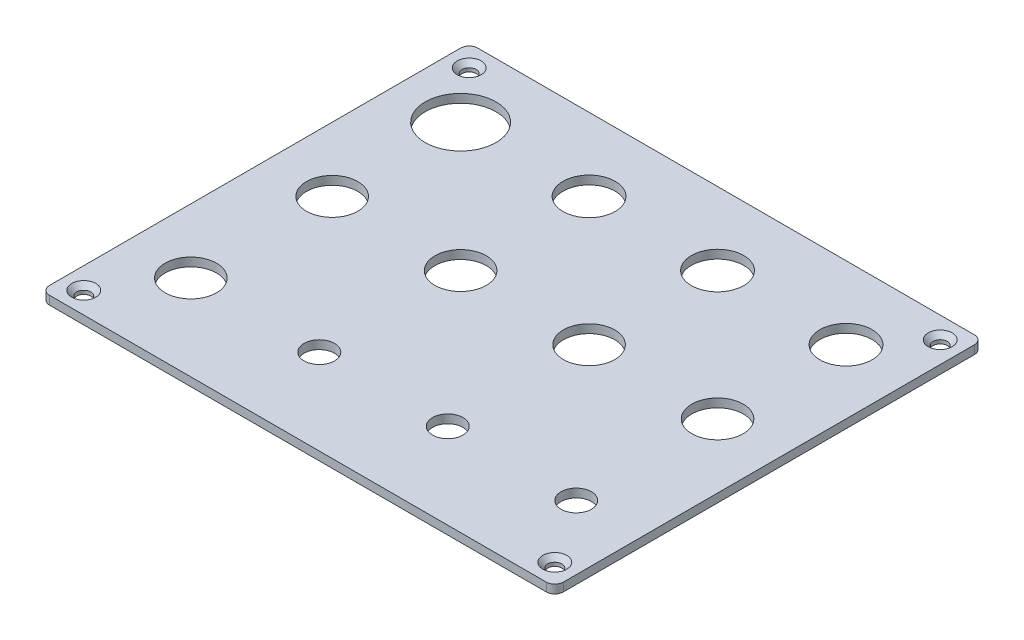
ISO-10303-21;
HEADER;
FILE_DESCRIPTION(('STEP AP214'),'2;1');
FILE_NAME('part.step','',(''),(''),'','','');
FILE_SCHEMA(('AUTOMOTIVE_DESIGN { 1 0 10303 214 1 1 1 1 }'));
ENDSEC;
DATA;
#1=APPLICATION_CONTEXT('core data for automotive mechanical design processes');
#2=APPLICATION_PROTOCOL_DEFINITION('international standard','automotive_design',2000,#1);
#3=PRODUCT_CONTEXT('',#1,'mechanical');
#4=PRODUCT('Part','Part','',(#3));
#5=PRODUCT_RELATED_PRODUCT_CATEGORY('part','',(#4));
#6=PRODUCT_DEFINITION_FORMATION('','',#4);
#7=PRODUCT_DEFINITION_CONTEXT('part definition',#1,'design');
#8=PRODUCT_DEFINITION('design','',#6,#7);
#9=PRODUCT_DEFINITION_SHAPE('','',#8);
#10=(LENGTH_UNIT() NAMED_UNIT(*) SI_UNIT(.MILLI.,.METRE.));
#11=(NAMED_UNIT(*) PLANE_ANGLE_UNIT() SI_UNIT($,.RADIAN.));
#12=(NAMED_UNIT(*) SI_UNIT($,.STERADIAN.) SOLID_ANGLE_UNIT());
#13=UNCERTAINTY_MEASURE_WITH_UNIT(LENGTH_MEASURE(1.E-05),#10,'distance_accuracy_value','');
#14=(GEOMETRIC_REPRESENTATION_CONTEXT(3) GLOBAL_UNCERTAINTY_ASSIGNED_CONTEXT((#13)) GLOBAL_UNIT_ASSIGNED_CONTEXT((#10,
#11,#12)) REPRESENTATION_CONTEXT('',''));
#15=CARTESIAN_POINT('',(0.,0.,0.));
#16=DIRECTION('',(0.,0.,1.));
#17=DIRECTION('',(1.,0.,0.));
#18=AXIS2_PLACEMENT_3D('',#15,#16,#17);
#19=CARTESIAN_POINT('',(-118.,2.,-1.99999999999999));
#20=DIRECTION('',(0.,-1.,0.));
#21=DIRECTION('',(0.,0.,-1.));
#22=AXIS2_PLACEMENT_3D('',#19,#20,#21);
#23=CYLINDRICAL_SURFACE('',#22,2.);
#24=DIRECTION('',(0.,-1.,0.));
#25=VECTOR('',#24,1.);
#26=CARTESIAN_POINT('',(-118.,2.,0.));
#27=LINE('',#26,#25);
#28=CARTESIAN_POINT('',(-118.,2.,0.));
#29=VERTEX_POINT('',#28);
#30=CARTESIAN_POINT('',(-118.,0.,0.));
#31=VERTEX_POINT('',#30);
#32=EDGE_CURVE('E165',#29,#31,#27,.T.);
#33=ORIENTED_EDGE('',*,*,#32,.F.);
#34=CARTESIAN_POINT('',(-118.,2.,-1.99999999999999));
#35=DIRECTION('',(0.,1.,0.));
#36=DIRECTION('',(0.,0.,1.));
#37=AXIS2_PLACEMENT_3D('',#34,#35,#36);
#38=CIRCLE('',#37,2.);
#39=CARTESIAN_POINT('',(-120.,2.,-1.99999999999999));
#40=VERTEX_POINT('',#39);
#41=EDGE_CURVE('E39',#40,#29,#38,.T.);
#42=ORIENTED_EDGE('',*,*,#41,.F.);
#43=DIRECTION('',(0.,-1.,0.));
#44=VECTOR('',#43,1.);
#45=CARTESIAN_POINT('',(-120.,2.,-1.99999999999999));
#46=LINE('',#45,#44);
#47=CARTESIAN_POINT('',(-120.,0.,-1.99999999999999));
#48=VERTEX_POINT('',#47);
#49=EDGE_CURVE('E168',#48,#40,#46,.F.);
#50=ORIENTED_EDGE('',*,*,#49,.F.);
#51=CARTESIAN_POINT('',(-118.,0.,-1.99999999999999));
#52=DIRECTION('',(0.,1.,0.));
#53=DIRECTION('',(0.,0.,1.));
#54=AXIS2_PLACEMENT_3D('',#51,#52,#53);
#55=CIRCLE('',#54,2.);
#56=EDGE_CURVE('E11',#31,#48,#55,.F.);
#57=ORIENTED_EDGE('',*,*,#56,.F.);
#58=EDGE_LOOP('',(#33,#42,#50,#57));
#59=FACE_BOUND('',#58,.T.);
#60=ADVANCED_FACE('F32',(#59),#23,.T.);
#61=CARTESIAN_POINT('',(-2.,2.,-2.));
#62=DIRECTION('',(0.,-1.,0.));
#63=DIRECTION('',(0.,0.,-1.));
#64=AXIS2_PLACEMENT_3D('',#61,#62,#63);
#65=CYLINDRICAL_SURFACE('',#64,2.);
#66=DIRECTION('',(0.,-1.,0.));
#67=VECTOR('',#66,1.);
#68=CARTESIAN_POINT('',(0.,2.,-2.));
#69=LINE('',#68,#67);
#70=CARTESIAN_POINT('',(0.,2.,-2.));
#71=VERTEX_POINT('',#70);
#72=CARTESIAN_POINT('',(0.,0.,-2.));
#73=VERTEX_POINT('',#72);
#74=EDGE_CURVE('E154',#71,#73,#69,.T.);
#75=ORIENTED_EDGE('',*,*,#74,.F.);
#76=CARTESIAN_POINT('',(-2.,2.,-2.));
#77=DIRECTION('',(0.,1.,0.));
#78=DIRECTION('',(0.,0.,1.));
#79=AXIS2_PLACEMENT_3D('',#76,#77,#78);
#80=CIRCLE('',#79,2.);
#81=CARTESIAN_POINT('',(-2.,2.,0.));
#82=VERTEX_POINT('',#81);
#83=EDGE_CURVE('E160',#82,#71,#80,.T.);
#84=ORIENTED_EDGE('',*,*,#83,.F.);
#85=DIRECTION('',(0.,-1.,0.));
#86=VECTOR('',#85,1.);
#87=CARTESIAN_POINT('',(-2.,2.,0.));
#88=LINE('',#87,#86);
#89=CARTESIAN_POINT('',(-2.,0.,0.));
#90=VERTEX_POINT('',#89);
#91=EDGE_CURVE('E157',#90,#82,#88,.F.);
#92=ORIENTED_EDGE('',*,*,#91,.F.);
#93=CARTESIAN_POINT('',(-2.,0.,-2.));
#94=DIRECTION('',(0.,1.,0.));
#95=DIRECTION('',(0.,0.,1.));
#96=AXIS2_PLACEMENT_3D('',#93,#94,#95);
#97=CIRCLE('',#96,2.);
#98=EDGE_CURVE('E162',#73,#90,#97,.F.);
#99=ORIENTED_EDGE('',*,*,#98,.F.);
#100=EDGE_LOOP('',(#75,#84,#92,#99));
#101=FACE_BOUND('',#100,.T.);
#102=ADVANCED_FACE('F207',(#101),#65,.T.);
#103=CARTESIAN_POINT('',(-2.,2.,-98.));
#104=DIRECTION('',(0.,-1.,0.));
#105=DIRECTION('',(0.,0.,-1.));
#106=AXIS2_PLACEMENT_3D('',#103,#104,#105);
#107=CYLINDRICAL_SURFACE('',#106,2.);
#108=DIRECTION('',(0.,-1.,0.));
#109=VECTOR('',#108,1.);
#110=CARTESIAN_POINT('',(-2.,2.,-100.));
#111=LINE('',#110,#109);
#112=CARTESIAN_POINT('',(-2.,2.,-100.));
#113=VERTEX_POINT('',#112);
#114=CARTESIAN_POINT('',(-2.,0.,-100.));
#115=VERTEX_POINT('',#114);
#116=EDGE_CURVE('E104',#113,#115,#111,.T.);
#117=ORIENTED_EDGE('',*,*,#116,.F.);
#118=CARTESIAN_POINT('',(-2.,2.,-98.));
#119=DIRECTION('',(0.,1.,0.));
#120=DIRECTION('',(0.,0.,1.));
#121=AXIS2_PLACEMENT_3D('',#118,#119,#120);
#122=CIRCLE('',#121,2.);
#123=CARTESIAN_POINT('',(0.,2.,-98.));
#124=VERTEX_POINT('',#123);
#125=EDGE_CURVE('E149',#124,#113,#122,.T.);
#126=ORIENTED_EDGE('',*,*,#125,.F.);
#127=DIRECTION('',(0.,-1.,0.));
#128=VECTOR('',#127,1.);
#129=CARTESIAN_POINT('',(0.,2.,-98.));
#130=LINE('',#129,#128);
#131=CARTESIAN_POINT('',(0.,0.,-98.));
#132=VERTEX_POINT('',#131);
#133=EDGE_CURVE('E146',#132,#124,#130,.F.);
#134=ORIENTED_EDGE('',*,*,#133,.F.);
#135=CARTESIAN_POINT('',(-2.,0.,-98.));
#136=DIRECTION('',(0.,1.,0.));
#137=DIRECTION('',(0.,0.,1.));
#138=AXIS2_PLACEMENT_3D('',#135,#136,#137);
#139=CIRCLE('',#138,2.);
#140=EDGE_CURVE('E151',#115,#132,#139,.F.);
#141=ORIENTED_EDGE('',*,*,#140,.F.);
#142=EDGE_LOOP('',(#117,#126,#134,#141));
#143=FACE_BOUND('',#142,.T.);
#144=ADVANCED_FACE('F202',(#143),#107,.T.);
#145=CARTESIAN_POINT('',(-118.,2.,-98.));
#146=DIRECTION('',(0.,-1.,0.));
#147=DIRECTION('',(0.,0.,-1.));
#148=AXIS2_PLACEMENT_3D('',#145,#146,#147);
#149=CYLINDRICAL_SURFACE('',#148,2.);
#150=DIRECTION('',(0.,-1.,0.));
#151=VECTOR('',#150,1.);
#152=CARTESIAN_POINT('',(-120.,2.,-98.));
#153=LINE('',#152,#151);
#154=CARTESIAN_POINT('',(-120.,2.,-98.));
#155=VERTEX_POINT('',#154);
#156=CARTESIAN_POINT('',(-120.,0.,-98.));
#157=VERTEX_POINT('',#156);
#158=EDGE_CURVE('E99',#155,#157,#153,.T.);
#159=ORIENTED_EDGE('',*,*,#158,.F.);
#160=CARTESIAN_POINT('',(-118.,2.,-98.));
#161=DIRECTION('',(0.,1.,0.));
#162=DIRECTION('',(0.,0.,1.));
#163=AXIS2_PLACEMENT_3D('',#160,#161,#162);
#164=CIRCLE('',#163,2.);
#165=CARTESIAN_POINT('',(-118.,2.,-100.));
#166=VERTEX_POINT('',#165);
#167=EDGE_CURVE('E105',#166,#155,#164,.T.);
#168=ORIENTED_EDGE('',*,*,#167,.F.);
#169=DIRECTION('',(0.,-1.,0.));
#170=VECTOR('',#169,1.);
#171=CARTESIAN_POINT('',(-118.,2.,-100.));
#172=LINE('',#171,#170);
#173=CARTESIAN_POINT('',(-118.,0.,-100.));
#174=VERTEX_POINT('',#173);
#175=EDGE_CURVE('E102',#174,#166,#172,.F.);
#176=ORIENTED_EDGE('',*,*,#175,.F.);
#177=CARTESIAN_POINT('',(-118.,0.,-98.));
#178=DIRECTION('',(0.,1.,0.));
#179=DIRECTION('',(0.,0.,1.));
#180=AXIS2_PLACEMENT_3D('',#177,#178,#179);
#181=CIRCLE('',#180,2.);
#182=EDGE_CURVE('E95',#157,#174,#181,.F.);
#183=ORIENTED_EDGE('',*,*,#182,.F.);
#184=EDGE_LOOP('',(#159,#168,#176,#183));
#185=FACE_BOUND('',#184,.T.);
#186=ADVANCED_FACE('F97',(#185),#149,.T.);
#187=CARTESIAN_POINT('',(0.,2.,0.));
#188=DIRECTION('',(-1.,0.,0.));
#189=DIRECTION('',(0.,0.,1.));
#190=AXIS2_PLACEMENT_3D('',#187,#188,#189);
#191=PLANE('',#190);
#192=DIRECTION('',(0.,0.,-1.));
#193=VECTOR('',#192,1.);
#194=CARTESIAN_POINT('',(0.,2.,0.));
#195=LINE('',#194,#193);
#196=EDGE_CURVE('E119',#71,#124,#195,.T.);
#197=ORIENTED_EDGE('',*,*,#196,.F.);
#198=ORIENTED_EDGE('',*,*,#74,.T.);
#199=DIRECTION('',(0.,0.,-1.));
#200=VECTOR('',#199,1.);
#201=CARTESIAN_POINT('',(0.,0.,0.));
#202=LINE('',#201,#200);
#203=EDGE_CURVE('E121',#73,#132,#202,.T.);
#204=ORIENTED_EDGE('',*,*,#203,.T.);
#205=ORIENTED_EDGE('',*,*,#133,.T.);
#206=EDGE_LOOP('',(#197,#198,#204,#205));
#207=FACE_BOUND('',#206,.T.);
#208=ADVANCED_FACE('F204',(#207),#191,.F.);
#209=CARTESIAN_POINT('',(0.,2.,-100.));
#210=DIRECTION('',(0.,0.,1.));
#211=DIRECTION('',(1.,0.,0.));
#212=AXIS2_PLACEMENT_3D('',#209,#210,#211);
#213=PLANE('',#212);
#214=DIRECTION('',(-1.,0.,0.));
#215=VECTOR('',#214,1.);
#216=CARTESIAN_POINT('',(0.,2.,-100.));
#217=LINE('',#216,#215);
#218=EDGE_CURVE('E177',#113,#166,#217,.T.);
#219=ORIENTED_EDGE('',*,*,#218,.F.);
#220=ORIENTED_EDGE('',*,*,#116,.T.);
#221=DIRECTION('',(-1.,0.,0.));
#222=VECTOR('',#221,1.);
#223=CARTESIAN_POINT('',(0.,0.,-100.));
#224=LINE('',#223,#222);
#225=EDGE_CURVE('E117',#115,#174,#224,.T.);
#226=ORIENTED_EDGE('',*,*,#225,.T.);
#227=ORIENTED_EDGE('',*,*,#175,.T.);
#228=EDGE_LOOP('',(#219,#220,#226,#227));
#229=FACE_BOUND('',#228,.T.);
#230=ADVANCED_FACE('F199',(#229),#213,.F.);
#231=CARTESIAN_POINT('',(-120.,2.,0.));
#232=DIRECTION('',(1.,0.,0.));
#233=DIRECTION('',(0.,0.,-1.));
#234=AXIS2_PLACEMENT_3D('',#231,#232,#233);
#235=PLANE('',#234);
#236=DIRECTION('',(0.,0.,1.));
#237=VECTOR('',#236,1.);
#238=CARTESIAN_POINT('',(-120.,0.,0.));
#239=LINE('',#238,#237);
#240=EDGE_CURVE('E110',#157,#48,#239,.T.);
#241=ORIENTED_EDGE('',*,*,#240,.T.);
#242=ORIENTED_EDGE('',*,*,#49,.T.);
#243=DIRECTION('',(0.,0.,1.));
#244=VECTOR('',#243,1.);
#245=CARTESIAN_POINT('',(-120.,2.,0.));
#246=LINE('',#245,#244);
#247=EDGE_CURVE('E112',#155,#40,#246,.T.);
#248=ORIENTED_EDGE('',*,*,#247,.F.);
#249=ORIENTED_EDGE('',*,*,#158,.T.);
#250=EDGE_LOOP('',(#241,#242,#248,#249));
#251=FACE_BOUND('',#250,.T.);
#252=ADVANCED_FACE('F109',(#251),#235,.F.);
#253=CARTESIAN_POINT('',(0.,2.,0.));
#254=DIRECTION('',(0.,0.,-1.));
#255=DIRECTION('',(-1.,0.,0.));
#256=AXIS2_PLACEMENT_3D('',#253,#254,#255);
#257=PLANE('',#256);
#258=DIRECTION('',(1.,0.,0.));
#259=VECTOR('',#258,1.);
#260=CARTESIAN_POINT('',(0.,2.,0.));
#261=LINE('',#260,#259);
#262=EDGE_CURVE('E113',#29,#82,#261,.T.);
#263=ORIENTED_EDGE('',*,*,#262,.F.);
#264=ORIENTED_EDGE('',*,*,#32,.T.);
#265=DIRECTION('',(1.,0.,0.));
#266=VECTOR('',#265,1.);
#267=CARTESIAN_POINT('',(0.,0.,0.));
#268=LINE('',#267,#266);
#269=EDGE_CURVE('E116',#31,#90,#268,.T.);
#270=ORIENTED_EDGE('',*,*,#269,.T.);
#271=ORIENTED_EDGE('',*,*,#91,.T.);
#272=EDGE_LOOP('',(#263,#264,#270,#271));
#273=FACE_BOUND('',#272,.T.);
#274=ADVANCED_FACE('F174',(#273),#257,.F.);
#275=CARTESIAN_POINT('',(0.,2.,0.));
#276=DIRECTION('',(0.,1.,0.));
#277=DIRECTION('',(0.,0.,1.));
#278=AXIS2_PLACEMENT_3D('',#275,#276,#277);
#279=PLANE('',#278);
#280=CARTESIAN_POINT('',(-115.,2.,-4.99999999999999));
#281=DIRECTION('',(0.,1.,0.));
#282=DIRECTION('',(0.,0.,1.));
#283=AXIS2_PLACEMENT_3D('',#280,#281,#282);
#284=CIRCLE('',#283,2.79999999999999);
#285=CARTESIAN_POINT('',(-115.,2.,-2.2));
#286=VERTEX_POINT('',#285);
#287=EDGE_CURVE('E140',#286,#286,#284,.T.);
#288=ORIENTED_EDGE('',*,*,#287,.F.);
#289=EDGE_LOOP('',(#288));
#290=FACE_BOUND('',#289,.T.);
#291=CARTESIAN_POINT('',(-5.,2.,-4.99999999999999));
#292=DIRECTION('',(0.,1.,0.));
#293=DIRECTION('',(0.,0.,1.));
#294=AXIS2_PLACEMENT_3D('',#291,#292,#293);
#295=CIRCLE('',#294,2.8);
#296=CARTESIAN_POINT('',(-5.,2.,-2.19999999999999));
#297=VERTEX_POINT('',#296);
#298=EDGE_CURVE('E137',#297,#297,#295,.T.);
#299=ORIENTED_EDGE('',*,*,#298,.F.);
#300=EDGE_LOOP('',(#299));
#301=FACE_BOUND('',#300,.T.);
#302=CARTESIAN_POINT('',(-5.,2.,-95.));
#303=DIRECTION('',(0.,1.,0.));
#304=DIRECTION('',(0.,0.,1.));
#305=AXIS2_PLACEMENT_3D('',#302,#303,#304);
#306=CIRCLE('',#305,2.8);
#307=CARTESIAN_POINT('',(-5.,2.,-92.2));
#308=VERTEX_POINT('',#307);
#309=EDGE_CURVE('E133',#308,#308,#306,.T.);
#310=ORIENTED_EDGE('',*,*,#309,.F.);
#311=EDGE_LOOP('',(#310));
#312=FACE_BOUND('',#311,.T.);
#313=CARTESIAN_POINT('',(-115.,2.,-95.));
#314=DIRECTION('',(0.,1.,0.));
#315=DIRECTION('',(0.,0.,1.));
#316=AXIS2_PLACEMENT_3D('',#313,#314,#315);
#317=CIRCLE('',#316,2.79999999999999);
#318=CARTESIAN_POINT('',(-115.,2.,-92.2));
#319=VERTEX_POINT('',#318);
#320=EDGE_CURVE('E129',#319,#319,#317,.T.);
#321=ORIENTED_EDGE('',*,*,#320,.F.);
#322=EDGE_LOOP('',(#321));
#323=FACE_BOUND('',#322,.T.);
#324=CARTESIAN_POINT('',(-105.,2.,-20.));
#325=DIRECTION('',(0.,1.,0.));
#326=DIRECTION('',(0.,0.,1.));
#327=AXIS2_PLACEMENT_3D('',#324,#325,#326);
#328=CIRCLE('',#327,6.);
#329=CARTESIAN_POINT('',(-105.,2.,-14.));
#330=VERTEX_POINT('',#329);
#331=EDGE_CURVE('E332',#330,#330,#328,.T.);
#332=ORIENTED_EDGE('',*,*,#331,.F.);
#333=EDGE_LOOP('',(#332));
#334=FACE_BOUND('',#333,.T.);
#335=CARTESIAN_POINT('',(-15.,2.,-20.));
#336=DIRECTION('',(0.,1.,0.));
#337=DIRECTION('',(0.,0.,1.));
#338=AXIS2_PLACEMENT_3D('',#335,#336,#337);
#339=CIRCLE('',#338,3.55);
#340=CARTESIAN_POINT('',(-15.,2.,-16.45));
#341=VERTEX_POINT('',#340);
#342=EDGE_CURVE('E336',#341,#341,#339,.T.);
#343=ORIENTED_EDGE('',*,*,#342,.F.);
#344=EDGE_LOOP('',(#343));
#345=FACE_BOUND('',#344,.T.);
#346=CARTESIAN_POINT('',(-45.,2.,-20.));
#347=DIRECTION('',(0.,1.,0.));
#348=DIRECTION('',(0.,0.,1.));
#349=AXIS2_PLACEMENT_3D('',#346,#347,#348);
#350=CIRCLE('',#349,3.55);
#351=CARTESIAN_POINT('',(-45.,2.,-16.45));
#352=VERTEX_POINT('',#351);
#353=EDGE_CURVE('E342',#352,#352,#350,.T.);
#354=ORIENTED_EDGE('',*,*,#353,.F.);
#355=EDGE_LOOP('',(#354));
#356=FACE_BOUND('',#355,.T.);
#357=CARTESIAN_POINT('',(-75.,2.,-20.));
#358=DIRECTION('',(0.,1.,0.));
#359=DIRECTION('',(0.,0.,1.));
#360=AXIS2_PLACEMENT_3D('',#357,#358,#359);
#361=CIRCLE('',#360,3.55);
#362=CARTESIAN_POINT('',(-75.,2.,-16.45));
#363=VERTEX_POINT('',#362);
#364=EDGE_CURVE('E348',#363,#363,#361,.T.);
#365=ORIENTED_EDGE('',*,*,#364,.F.);
#366=EDGE_LOOP('',(#365));
#367=FACE_BOUND('',#366,.T.);
#368=CARTESIAN_POINT('',(-15.,2.,-83.));
#369=DIRECTION('',(0.,1.,0.));
#370=DIRECTION('',(0.,0.,1.));
#371=AXIS2_PLACEMENT_3D('',#368,#369,#370);
#372=CIRCLE('',#371,6.09999999999999);
#373=CARTESIAN_POINT('',(-15.,2.,-76.9));
#374=VERTEX_POINT('',#373);
#375=EDGE_CURVE('E354',#374,#374,#372,.T.);
#376=ORIENTED_EDGE('',*,*,#375,.F.);
#377=EDGE_LOOP('',(#376));
#378=FACE_BOUND('',#377,.T.);
#379=CARTESIAN_POINT('',(-45.,2.,-83.));
#380=DIRECTION('',(0.,1.,0.));
#381=DIRECTION('',(0.,0.,1.));
#382=AXIS2_PLACEMENT_3D('',#379,#380,#381);
#383=CIRCLE('',#382,6.1);
#384=CARTESIAN_POINT('',(-45.,2.,-76.9));
#385=VERTEX_POINT('',#384);
#386=EDGE_CURVE('E360',#385,#385,#383,.T.);
#387=ORIENTED_EDGE('',*,*,#386,.F.);
#388=EDGE_LOOP('',(#387));
#389=FACE_BOUND('',#388,.T.);
#390=CARTESIAN_POINT('',(-75.,2.,-83.));
#391=DIRECTION('',(0.,1.,0.));
#392=DIRECTION('',(0.,0.,1.));
#393=AXIS2_PLACEMENT_3D('',#390,#391,#392);
#394=CIRCLE('',#393,6.09999999999999);
#395=CARTESIAN_POINT('',(-75.,2.,-76.9));
#396=VERTEX_POINT('',#395);
#397=EDGE_CURVE('E366',#396,#396,#394,.T.);
#398=ORIENTED_EDGE('',*,*,#397,.F.);
#399=EDGE_LOOP('',(#398));
#400=FACE_BOUND('',#399,.T.);
#401=CARTESIAN_POINT('',(-105.,2.,-83.));
#402=DIRECTION('',(0.,1.,0.));
#403=DIRECTION('',(0.,0.,1.));
#404=AXIS2_PLACEMENT_3D('',#401,#402,#403);
#405=CIRCLE('',#404,8.25000000000001);
#406=CARTESIAN_POINT('',(-105.,2.,-74.75));
#407=VERTEX_POINT('',#406);
#408=EDGE_CURVE('E372',#407,#407,#405,.T.);
#409=ORIENTED_EDGE('',*,*,#408,.F.);
#410=EDGE_LOOP('',(#409));
#411=FACE_BOUND('',#410,.T.);
#412=CARTESIAN_POINT('',(-15.,2.,-53.));
#413=DIRECTION('',(0.,1.,0.));
#414=DIRECTION('',(0.,0.,1.));
#415=AXIS2_PLACEMENT_3D('',#412,#413,#414);
#416=CIRCLE('',#415,6.00000000000001);
#417=CARTESIAN_POINT('',(-15.,2.,-47.));
#418=VERTEX_POINT('',#417);
#419=EDGE_CURVE('E378',#418,#418,#416,.T.);
#420=ORIENTED_EDGE('',*,*,#419,.F.);
#421=EDGE_LOOP('',(#420));
#422=FACE_BOUND('',#421,.T.);
#423=CARTESIAN_POINT('',(-45.,2.,-53.));
#424=DIRECTION('',(0.,1.,0.));
#425=DIRECTION('',(0.,0.,1.));
#426=AXIS2_PLACEMENT_3D('',#423,#424,#425);
#427=CIRCLE('',#426,6.);
#428=CARTESIAN_POINT('',(-45.,2.,-47.));
#429=VERTEX_POINT('',#428);
#430=EDGE_CURVE('E384',#429,#429,#427,.T.);
#431=ORIENTED_EDGE('',*,*,#430,.F.);
#432=EDGE_LOOP('',(#431));
#433=FACE_BOUND('',#432,.T.);
#434=CARTESIAN_POINT('',(-75.,2.,-53.));
#435=DIRECTION('',(0.,1.,0.));
#436=DIRECTION('',(0.,0.,1.));
#437=AXIS2_PLACEMENT_3D('',#434,#435,#436);
#438=CIRCLE('',#437,6.);
#439=CARTESIAN_POINT('',(-75.,2.,-47.));
#440=VERTEX_POINT('',#439);
#441=EDGE_CURVE('E192',#440,#440,#438,.T.);
#442=ORIENTED_EDGE('',*,*,#441,.F.);
#443=EDGE_LOOP('',(#442));
#444=FACE_BOUND('',#443,.T.);
#445=CARTESIAN_POINT('',(-105.,2.,-53.));
#446=DIRECTION('',(0.,1.,0.));
#447=DIRECTION('',(0.,0.,1.));
#448=AXIS2_PLACEMENT_3D('',#445,#446,#447);
#449=CIRCLE('',#448,6.);
#450=CARTESIAN_POINT('',(-105.,2.,-47.));
#451=VERTEX_POINT('',#450);
#452=EDGE_CURVE('E184',#451,#451,#449,.T.);
#453=ORIENTED_EDGE('',*,*,#452,.F.);
#454=EDGE_LOOP('',(#453));
#455=FACE_BOUND('',#454,.T.);
#456=ORIENTED_EDGE('',*,*,#247,.T.);
#457=ORIENTED_EDGE('',*,*,#41,.T.);
#458=ORIENTED_EDGE('',*,*,#262,.T.);
#459=ORIENTED_EDGE('',*,*,#83,.T.);
#460=ORIENTED_EDGE('',*,*,#196,.T.);
#461=ORIENTED_EDGE('',*,*,#125,.T.);
#462=ORIENTED_EDGE('',*,*,#218,.T.);
#463=ORIENTED_EDGE('',*,*,#167,.T.);
#464=EDGE_LOOP('',(#456,#457,#458,#459,#460,#461,#462,#463));
#465=FACE_BOUND('',#464,.T.);
#466=ADVANCED_FACE('F170',(#290,#301,#312,#323,#334,#345,#356,#367,#378,#389,#400,#411,#422,
#433,#444,#455,#465),#279,.T.);
#467=CARTESIAN_POINT('',(0.,0.,0.));
#468=DIRECTION('',(0.,1.,0.));
#469=DIRECTION('',(0.,0.,1.));
#470=AXIS2_PLACEMENT_3D('',#467,#468,#469);
#471=PLANE('',#470);
#472=CARTESIAN_POINT('',(-115.,0.,-4.99999999999999));
#473=DIRECTION('',(0.,1.,0.));
#474=DIRECTION('',(0.,0.,1.));
#475=AXIS2_PLACEMENT_3D('',#472,#473,#474);
#476=CIRCLE('',#475,1.65);
#477=CARTESIAN_POINT('',(-115.,0.,-3.34999999999999));
#478=VERTEX_POINT('',#477);
#479=EDGE_CURVE('E128',#478,#478,#476,.T.);
#480=ORIENTED_EDGE('',*,*,#479,.T.);
#481=EDGE_LOOP('',(#480));
#482=FACE_BOUND('',#481,.T.);
#483=CARTESIAN_POINT('',(-5.,0.,-4.99999999999999));
#484=DIRECTION('',(0.,1.,0.));
#485=DIRECTION('',(0.,0.,1.));
#486=AXIS2_PLACEMENT_3D('',#483,#484,#485);
#487=CIRCLE('',#486,1.65);
#488=CARTESIAN_POINT('',(-5.,0.,-3.34999999999999));
#489=VERTEX_POINT('',#488);
#490=EDGE_CURVE('E319',#489,#489,#487,.T.);
#491=ORIENTED_EDGE('',*,*,#490,.T.);
#492=EDGE_LOOP('',(#491));
#493=FACE_BOUND('',#492,.T.);
#494=CARTESIAN_POINT('',(-5.,0.,-95.));
#495=DIRECTION('',(0.,1.,0.));
#496=DIRECTION('',(0.,0.,1.));
#497=AXIS2_PLACEMENT_3D('',#494,#495,#496);
#498=CIRCLE('',#497,1.65);
#499=CARTESIAN_POINT('',(-5.,0.,-93.35));
#500=VERTEX_POINT('',#499);
#501=EDGE_CURVE('E322',#500,#500,#498,.T.);
#502=ORIENTED_EDGE('',*,*,#501,.T.);
#503=EDGE_LOOP('',(#502));
#504=FACE_BOUND('',#503,.T.);
#505=CARTESIAN_POINT('',(-115.,0.,-95.));
#506=DIRECTION('',(0.,1.,0.));
#507=DIRECTION('',(0.,0.,1.));
#508=AXIS2_PLACEMENT_3D('',#505,#506,#507);
#509=CIRCLE('',#508,1.65);
#510=CARTESIAN_POINT('',(-115.,0.,-93.35));
#511=VERTEX_POINT('',#510);
#512=EDGE_CURVE('E329',#511,#511,#509,.T.);
#513=ORIENTED_EDGE('',*,*,#512,.T.);
#514=EDGE_LOOP('',(#513));
#515=FACE_BOUND('',#514,.T.);
#516=CARTESIAN_POINT('',(-105.,0.,-20.));
#517=DIRECTION('',(0.,1.,0.));
#518=DIRECTION('',(0.,0.,1.));
#519=AXIS2_PLACEMENT_3D('',#516,#517,#518);
#520=CIRCLE('',#519,6.);
#521=CARTESIAN_POINT('',(-105.,0.,-14.));
#522=VERTEX_POINT('',#521);
#523=EDGE_CURVE('E333',#522,#522,#520,.T.);
#524=ORIENTED_EDGE('',*,*,#523,.T.);
#525=EDGE_LOOP('',(#524));
#526=FACE_BOUND('',#525,.T.);
#527=CARTESIAN_POINT('',(-15.,0.,-20.));
#528=DIRECTION('',(0.,1.,0.));
#529=DIRECTION('',(0.,0.,1.));
#530=AXIS2_PLACEMENT_3D('',#527,#528,#529);
#531=CIRCLE('',#530,3.55);
#532=CARTESIAN_POINT('',(-15.,0.,-16.45));
#533=VERTEX_POINT('',#532);
#534=EDGE_CURVE('E339',#533,#533,#531,.T.);
#535=ORIENTED_EDGE('',*,*,#534,.T.);
#536=EDGE_LOOP('',(#535));
#537=FACE_BOUND('',#536,.T.);
#538=CARTESIAN_POINT('',(-45.,0.,-20.));
#539=DIRECTION('',(0.,1.,0.));
#540=DIRECTION('',(0.,0.,1.));
#541=AXIS2_PLACEMENT_3D('',#538,#539,#540);
#542=CIRCLE('',#541,3.55);
#543=CARTESIAN_POINT('',(-45.,0.,-16.45));
#544=VERTEX_POINT('',#543);
#545=EDGE_CURVE('E345',#544,#544,#542,.T.);
#546=ORIENTED_EDGE('',*,*,#545,.T.);
#547=EDGE_LOOP('',(#546));
#548=FACE_BOUND('',#547,.T.);
#549=CARTESIAN_POINT('',(-75.,0.,-20.));
#550=DIRECTION('',(0.,1.,0.));
#551=DIRECTION('',(0.,0.,1.));
#552=AXIS2_PLACEMENT_3D('',#549,#550,#551);
#553=CIRCLE('',#552,3.55);
#554=CARTESIAN_POINT('',(-75.,0.,-16.45));
#555=VERTEX_POINT('',#554);
#556=EDGE_CURVE('E351',#555,#555,#553,.T.);
#557=ORIENTED_EDGE('',*,*,#556,.T.);
#558=EDGE_LOOP('',(#557));
#559=FACE_BOUND('',#558,.T.);
#560=CARTESIAN_POINT('',(-15.,0.,-83.));
#561=DIRECTION('',(0.,1.,0.));
#562=DIRECTION('',(0.,0.,1.));
#563=AXIS2_PLACEMENT_3D('',#560,#561,#562);
#564=CIRCLE('',#563,6.09999999999999);
#565=CARTESIAN_POINT('',(-15.,0.,-76.9));
#566=VERTEX_POINT('',#565);
#567=EDGE_CURVE('E357',#566,#566,#564,.T.);
#568=ORIENTED_EDGE('',*,*,#567,.T.);
#569=EDGE_LOOP('',(#568));
#570=FACE_BOUND('',#569,.T.);
#571=CARTESIAN_POINT('',(-45.,0.,-83.));
#572=DIRECTION('',(0.,1.,0.));
#573=DIRECTION('',(0.,0.,1.));
#574=AXIS2_PLACEMENT_3D('',#571,#572,#573);
#575=CIRCLE('',#574,6.1);
#576=CARTESIAN_POINT('',(-45.,0.,-76.9));
#577=VERTEX_POINT('',#576);
#578=EDGE_CURVE('E363',#577,#577,#575,.T.);
#579=ORIENTED_EDGE('',*,*,#578,.T.);
#580=EDGE_LOOP('',(#579));
#581=FACE_BOUND('',#580,.T.);
#582=CARTESIAN_POINT('',(-75.,0.,-83.));
#583=DIRECTION('',(0.,1.,0.));
#584=DIRECTION('',(0.,0.,1.));
#585=AXIS2_PLACEMENT_3D('',#582,#583,#584);
#586=CIRCLE('',#585,6.09999999999999);
#587=CARTESIAN_POINT('',(-75.,0.,-76.9));
#588=VERTEX_POINT('',#587);
#589=EDGE_CURVE('E369',#588,#588,#586,.T.);
#590=ORIENTED_EDGE('',*,*,#589,.T.);
#591=EDGE_LOOP('',(#590));
#592=FACE_BOUND('',#591,.T.);
#593=CARTESIAN_POINT('',(-105.,0.,-83.));
#594=DIRECTION('',(0.,1.,0.));
#595=DIRECTION('',(0.,0.,1.));
#596=AXIS2_PLACEMENT_3D('',#593,#594,#595);
#597=CIRCLE('',#596,8.25000000000001);
#598=CARTESIAN_POINT('',(-105.,0.,-74.75));
#599=VERTEX_POINT('',#598);
#600=EDGE_CURVE('E375',#599,#599,#597,.T.);
#601=ORIENTED_EDGE('',*,*,#600,.T.);
#602=EDGE_LOOP('',(#601));
#603=FACE_BOUND('',#602,.T.);
#604=CARTESIAN_POINT('',(-15.,0.,-53.));
#605=DIRECTION('',(0.,1.,0.));
#606=DIRECTION('',(0.,0.,1.));
#607=AXIS2_PLACEMENT_3D('',#604,#605,#606);
#608=CIRCLE('',#607,6.00000000000001);
#609=CARTESIAN_POINT('',(-15.,0.,-47.));
#610=VERTEX_POINT('',#609);
#611=EDGE_CURVE('E381',#610,#610,#608,.T.);
#612=ORIENTED_EDGE('',*,*,#611,.T.);
#613=EDGE_LOOP('',(#612));
#614=FACE_BOUND('',#613,.T.);
#615=CARTESIAN_POINT('',(-45.,0.,-53.));
#616=DIRECTION('',(0.,1.,0.));
#617=DIRECTION('',(0.,0.,1.));
#618=AXIS2_PLACEMENT_3D('',#615,#616,#617);
#619=CIRCLE('',#618,6.);
#620=CARTESIAN_POINT('',(-45.,0.,-47.));
#621=VERTEX_POINT('',#620);
#622=EDGE_CURVE('E387',#621,#621,#619,.T.);
#623=ORIENTED_EDGE('',*,*,#622,.T.);
#624=EDGE_LOOP('',(#623));
#625=FACE_BOUND('',#624,.T.);
#626=CARTESIAN_POINT('',(-75.,0.,-53.));
#627=DIRECTION('',(0.,1.,0.));
#628=DIRECTION('',(0.,0.,1.));
#629=AXIS2_PLACEMENT_3D('',#626,#627,#628);
#630=CIRCLE('',#629,6.);
#631=CARTESIAN_POINT('',(-75.,0.,-47.));
#632=VERTEX_POINT('',#631);
#633=EDGE_CURVE('E189',#632,#632,#630,.T.);
#634=ORIENTED_EDGE('',*,*,#633,.T.);
#635=EDGE_LOOP('',(#634));
#636=FACE_BOUND('',#635,.T.);
#637=CARTESIAN_POINT('',(-105.,0.,-53.));
#638=DIRECTION('',(0.,1.,0.));
#639=DIRECTION('',(0.,0.,1.));
#640=AXIS2_PLACEMENT_3D('',#637,#638,#639);
#641=CIRCLE('',#640,6.);
#642=CARTESIAN_POINT('',(-105.,0.,-47.));
#643=VERTEX_POINT('',#642);
#644=EDGE_CURVE('E180',#643,#643,#641,.T.);
#645=ORIENTED_EDGE('',*,*,#644,.T.);
#646=EDGE_LOOP('',(#645));
#647=FACE_BOUND('',#646,.T.);
#648=ORIENTED_EDGE('',*,*,#269,.F.);
#649=ORIENTED_EDGE('',*,*,#56,.T.);
#650=ORIENTED_EDGE('',*,*,#240,.F.);
#651=ORIENTED_EDGE('',*,*,#182,.T.);
#652=ORIENTED_EDGE('',*,*,#225,.F.);
#653=ORIENTED_EDGE('',*,*,#140,.T.);
#654=ORIENTED_EDGE('',*,*,#203,.F.);
#655=ORIENTED_EDGE('',*,*,#98,.T.);
#656=EDGE_LOOP('',(#648,#649,#650,#651,#652,#653,#654,#655));
#657=FACE_BOUND('',#656,.T.);
#658=ADVANCED_FACE('F115',(#482,#493,#504,#515,#526,#537,#548,#559,#570,#581,#592,#603,#614,
#625,#636,#647,#657),#471,.F.);
#659=CARTESIAN_POINT('',(-105.,0.,-53.));
#660=DIRECTION('',(0.,1.,0.));
#661=DIRECTION('',(0.,0.,1.));
#662=AXIS2_PLACEMENT_3D('',#659,#660,#661);
#663=CYLINDRICAL_SURFACE('',#662,6.);
#664=ORIENTED_EDGE('',*,*,#644,.F.);
#665=EDGE_LOOP('',(#664));
#666=FACE_BOUND('',#665,.T.);
#667=ORIENTED_EDGE('',*,*,#452,.T.);
#668=EDGE_LOOP('',(#667));
#669=FACE_BOUND('',#668,.T.);
#670=ADVANCED_FACE('F227',(#666,#669),#663,.F.);
#671=CARTESIAN_POINT('',(-75.,0.,-53.));
#672=DIRECTION('',(0.,1.,0.));
#673=DIRECTION('',(0.,0.,1.));
#674=AXIS2_PLACEMENT_3D('',#671,#672,#673);
#675=CYLINDRICAL_SURFACE('',#674,6.);
#676=ORIENTED_EDGE('',*,*,#633,.F.);
#677=EDGE_LOOP('',(#676));
#678=FACE_BOUND('',#677,.T.);
#679=ORIENTED_EDGE('',*,*,#441,.T.);
#680=EDGE_LOOP('',(#679));
#681=FACE_BOUND('',#680,.T.);
#682=ADVANCED_FACE('F234',(#678,#681),#675,.F.);
#683=CARTESIAN_POINT('',(-45.,0.,-53.));
#684=DIRECTION('',(0.,1.,0.));
#685=DIRECTION('',(0.,0.,1.));
#686=AXIS2_PLACEMENT_3D('',#683,#684,#685);
#687=CYLINDRICAL_SURFACE('',#686,6.);
#688=ORIENTED_EDGE('',*,*,#622,.F.);
#689=EDGE_LOOP('',(#688));
#690=FACE_BOUND('',#689,.T.);
#691=ORIENTED_EDGE('',*,*,#430,.T.);
#692=EDGE_LOOP('',(#691));
#693=FACE_BOUND('',#692,.T.);
#694=ADVANCED_FACE('F238',(#690,#693),#687,.F.);
#695=CARTESIAN_POINT('',(-15.,0.,-53.));
#696=DIRECTION('',(0.,1.,0.));
#697=DIRECTION('',(0.,0.,1.));
#698=AXIS2_PLACEMENT_3D('',#695,#696,#697);
#699=CYLINDRICAL_SURFACE('',#698,6.00000000000001);
#700=ORIENTED_EDGE('',*,*,#611,.F.);
#701=EDGE_LOOP('',(#700));
#702=FACE_BOUND('',#701,.T.);
#703=ORIENTED_EDGE('',*,*,#419,.T.);
#704=EDGE_LOOP('',(#703));
#705=FACE_BOUND('',#704,.T.);
#706=ADVANCED_FACE('F242',(#702,#705),#699,.F.);
#707=CARTESIAN_POINT('',(-105.,0.,-83.));
#708=DIRECTION('',(0.,1.,0.));
#709=DIRECTION('',(0.,0.,1.));
#710=AXIS2_PLACEMENT_3D('',#707,#708,#709);
#711=CYLINDRICAL_SURFACE('',#710,8.25000000000001);
#712=ORIENTED_EDGE('',*,*,#600,.F.);
#713=EDGE_LOOP('',(#712));
#714=FACE_BOUND('',#713,.T.);
#715=ORIENTED_EDGE('',*,*,#408,.T.);
#716=EDGE_LOOP('',(#715));
#717=FACE_BOUND('',#716,.T.);
#718=ADVANCED_FACE('F246',(#714,#717),#711,.F.);
#719=CARTESIAN_POINT('',(-75.,0.,-83.));
#720=DIRECTION('',(0.,1.,0.));
#721=DIRECTION('',(0.,0.,1.));
#722=AXIS2_PLACEMENT_3D('',#719,#720,#721);
#723=CYLINDRICAL_SURFACE('',#722,6.09999999999999);
#724=ORIENTED_EDGE('',*,*,#589,.F.);
#725=EDGE_LOOP('',(#724));
#726=FACE_BOUND('',#725,.T.);
#727=ORIENTED_EDGE('',*,*,#397,.T.);
#728=EDGE_LOOP('',(#727));
#729=FACE_BOUND('',#728,.T.);
#730=ADVANCED_FACE('F250',(#726,#729),#723,.F.);
#731=CARTESIAN_POINT('',(-45.,0.,-83.));
#732=DIRECTION('',(0.,1.,0.));
#733=DIRECTION('',(0.,0.,1.));
#734=AXIS2_PLACEMENT_3D('',#731,#732,#733);
#735=CYLINDRICAL_SURFACE('',#734,6.1);
#736=ORIENTED_EDGE('',*,*,#578,.F.);
#737=EDGE_LOOP('',(#736));
#738=FACE_BOUND('',#737,.T.);
#739=ORIENTED_EDGE('',*,*,#386,.T.);
#740=EDGE_LOOP('',(#739));
#741=FACE_BOUND('',#740,.T.);
#742=ADVANCED_FACE('F254',(#738,#741),#735,.F.);
#743=CARTESIAN_POINT('',(-15.,0.,-83.));
#744=DIRECTION('',(0.,1.,0.));
#745=DIRECTION('',(0.,0.,1.));
#746=AXIS2_PLACEMENT_3D('',#743,#744,#745);
#747=CYLINDRICAL_SURFACE('',#746,6.09999999999999);
#748=ORIENTED_EDGE('',*,*,#567,.F.);
#749=EDGE_LOOP('',(#748));
#750=FACE_BOUND('',#749,.T.);
#751=ORIENTED_EDGE('',*,*,#375,.T.);
#752=EDGE_LOOP('',(#751));
#753=FACE_BOUND('',#752,.T.);
#754=ADVANCED_FACE('F258',(#750,#753),#747,.F.);
#755=CARTESIAN_POINT('',(-75.,0.,-20.));
#756=DIRECTION('',(0.,1.,0.));
#757=DIRECTION('',(0.,0.,1.));
#758=AXIS2_PLACEMENT_3D('',#755,#756,#757);
#759=CYLINDRICAL_SURFACE('',#758,3.55);
#760=ORIENTED_EDGE('',*,*,#556,.F.);
#761=EDGE_LOOP('',(#760));
#762=FACE_BOUND('',#761,.T.);
#763=ORIENTED_EDGE('',*,*,#364,.T.);
#764=EDGE_LOOP('',(#763));
#765=FACE_BOUND('',#764,.T.);
#766=ADVANCED_FACE('F262',(#762,#765),#759,.F.);
#767=CARTESIAN_POINT('',(-45.,0.,-20.));
#768=DIRECTION('',(0.,1.,0.));
#769=DIRECTION('',(0.,0.,1.));
#770=AXIS2_PLACEMENT_3D('',#767,#768,#769);
#771=CYLINDRICAL_SURFACE('',#770,3.55);
#772=ORIENTED_EDGE('',*,*,#545,.F.);
#773=EDGE_LOOP('',(#772));
#774=FACE_BOUND('',#773,.T.);
#775=ORIENTED_EDGE('',*,*,#353,.T.);
#776=EDGE_LOOP('',(#775));
#777=FACE_BOUND('',#776,.T.);
#778=ADVANCED_FACE('F266',(#774,#777),#771,.F.);
#779=CARTESIAN_POINT('',(-15.,0.,-20.));
#780=DIRECTION('',(0.,1.,0.));
#781=DIRECTION('',(0.,0.,1.));
#782=AXIS2_PLACEMENT_3D('',#779,#780,#781);
#783=CYLINDRICAL_SURFACE('',#782,3.55);
#784=ORIENTED_EDGE('',*,*,#534,.F.);
#785=EDGE_LOOP('',(#784));
#786=FACE_BOUND('',#785,.T.);
#787=ORIENTED_EDGE('',*,*,#342,.T.);
#788=EDGE_LOOP('',(#787));
#789=FACE_BOUND('',#788,.T.);
#790=ADVANCED_FACE('F270',(#786,#789),#783,.F.);
#791=CARTESIAN_POINT('',(-105.,0.,-20.));
#792=DIRECTION('',(0.,1.,0.));
#793=DIRECTION('',(0.,0.,1.));
#794=AXIS2_PLACEMENT_3D('',#791,#792,#793);
#795=CYLINDRICAL_SURFACE('',#794,6.);
#796=ORIENTED_EDGE('',*,*,#523,.F.);
#797=EDGE_LOOP('',(#796));
#798=FACE_BOUND('',#797,.T.);
#799=ORIENTED_EDGE('',*,*,#331,.T.);
#800=EDGE_LOOP('',(#799));
#801=FACE_BOUND('',#800,.T.);
#802=ADVANCED_FACE('F274',(#798,#801),#795,.F.);
#803=CARTESIAN_POINT('',(-115.,0.,-95.));
#804=DIRECTION('',(0.,1.,0.));
#805=DIRECTION('',(0.,0.,1.));
#806=AXIS2_PLACEMENT_3D('',#803,#804,#805);
#807=CYLINDRICAL_SURFACE('',#806,1.65);
#808=CARTESIAN_POINT('',(-115.,0.850000000000015,-95.));
#809=DIRECTION('',(0.,1.,0.));
#810=DIRECTION('',(0.,0.,1.));
#811=AXIS2_PLACEMENT_3D('',#808,#809,#810);
#812=CIRCLE('',#811,1.65);
#813=CARTESIAN_POINT('',(-115.,0.850000000000015,-93.35));
#814=VERTEX_POINT('',#813);
#815=EDGE_CURVE('E125',#814,#814,#812,.T.);
#816=ORIENTED_EDGE('',*,*,#815,.T.);
#817=EDGE_LOOP('',(#816));
#818=FACE_BOUND('',#817,.T.);
#819=ORIENTED_EDGE('',*,*,#512,.F.);
#820=EDGE_LOOP('',(#819));
#821=FACE_BOUND('',#820,.T.);
#822=ADVANCED_FACE('F278',(#818,#821),#807,.F.);
#823=CARTESIAN_POINT('',(-5.,0.,-95.));
#824=DIRECTION('',(0.,1.,0.));
#825=DIRECTION('',(0.,0.,1.));
#826=AXIS2_PLACEMENT_3D('',#823,#824,#825);
#827=CYLINDRICAL_SURFACE('',#826,1.65);
#828=CARTESIAN_POINT('',(-5.,0.850000000000008,-95.));
#829=DIRECTION('',(0.,1.,0.));
#830=DIRECTION('',(0.,0.,1.));
#831=AXIS2_PLACEMENT_3D('',#828,#829,#830);
#832=CIRCLE('',#831,1.65);
#833=CARTESIAN_POINT('',(-5.,0.850000000000008,-93.35));
#834=VERTEX_POINT('',#833);
#835=EDGE_CURVE('E130',#834,#834,#832,.T.);
#836=ORIENTED_EDGE('',*,*,#835,.T.);
#837=EDGE_LOOP('',(#836));
#838=FACE_BOUND('',#837,.T.);
#839=ORIENTED_EDGE('',*,*,#501,.F.);
#840=EDGE_LOOP('',(#839));
#841=FACE_BOUND('',#840,.T.);
#842=ADVANCED_FACE('F282',(#838,#841),#827,.F.);
#843=CARTESIAN_POINT('',(-5.,0.,-4.99999999999999));
#844=DIRECTION('',(0.,1.,0.));
#845=DIRECTION('',(0.,0.,1.));
#846=AXIS2_PLACEMENT_3D('',#843,#844,#845);
#847=CYLINDRICAL_SURFACE('',#846,1.65);
#848=CARTESIAN_POINT('',(-5.,0.850000000000004,-4.99999999999999));
#849=DIRECTION('',(0.,1.,0.));
#850=DIRECTION('',(0.,0.,1.));
#851=AXIS2_PLACEMENT_3D('',#848,#849,#850);
#852=CIRCLE('',#851,1.65);
#853=CARTESIAN_POINT('',(-5.,0.850000000000004,-3.34999999999999));
#854=VERTEX_POINT('',#853);
#855=EDGE_CURVE('E134',#854,#854,#852,.T.);
#856=ORIENTED_EDGE('',*,*,#855,.T.);
#857=EDGE_LOOP('',(#856));
#858=FACE_BOUND('',#857,.T.);
#859=ORIENTED_EDGE('',*,*,#490,.F.);
#860=EDGE_LOOP('',(#859));
#861=FACE_BOUND('',#860,.T.);
#862=ADVANCED_FACE('F286',(#858,#861),#847,.F.);
#863=CARTESIAN_POINT('',(-115.,0.,-4.99999999999999));
#864=DIRECTION('',(0.,1.,0.));
#865=DIRECTION('',(0.,0.,1.));
#866=AXIS2_PLACEMENT_3D('',#863,#864,#865);
#867=CYLINDRICAL_SURFACE('',#866,1.65);
#868=CARTESIAN_POINT('',(-115.,0.850000000000014,-4.99999999999999));
#869=DIRECTION('',(0.,1.,0.));
#870=DIRECTION('',(0.,0.,1.));
#871=AXIS2_PLACEMENT_3D('',#868,#869,#870);
#872=CIRCLE('',#871,1.65);
#873=CARTESIAN_POINT('',(-115.,0.850000000000014,-3.34999999999999));
#874=VERTEX_POINT('',#873);
#875=EDGE_CURVE('E138',#874,#874,#872,.T.);
#876=ORIENTED_EDGE('',*,*,#875,.T.);
#877=EDGE_LOOP('',(#876));
#878=FACE_BOUND('',#877,.T.);
#879=ORIENTED_EDGE('',*,*,#479,.F.);
#880=EDGE_LOOP('',(#879));
#881=FACE_BOUND('',#880,.T.);
#882=ADVANCED_FACE('F290',(#878,#881),#867,.F.);
#883=CARTESIAN_POINT('',(-115.,2.,-95.));
#884=DIRECTION('',(0.,1.,0.));
#885=DIRECTION('',(0.,0.,1.));
#886=AXIS2_PLACEMENT_3D('',#883,#884,#885);
#887=CONICAL_SURFACE('',#886,2.79999999999999,0.78539816339745);
#888=ORIENTED_EDGE('',*,*,#320,.T.);
#889=EDGE_LOOP('',(#888));
#890=FACE_BOUND('',#889,.T.);
#891=ORIENTED_EDGE('',*,*,#815,.F.);
#892=EDGE_LOOP('',(#891));
#893=FACE_BOUND('',#892,.T.);
#894=ADVANCED_FACE('F294',(#890,#893),#887,.F.);
#895=CARTESIAN_POINT('',(-5.,2.,-95.));
#896=DIRECTION('',(0.,1.,0.));
#897=DIRECTION('',(0.,0.,1.));
#898=AXIS2_PLACEMENT_3D('',#895,#896,#897);
#899=CONICAL_SURFACE('',#898,2.8,0.78539816339745);
#900=ORIENTED_EDGE('',*,*,#309,.T.);
#901=EDGE_LOOP('',(#900));
#902=FACE_BOUND('',#901,.T.);
#903=ORIENTED_EDGE('',*,*,#835,.F.);
#904=EDGE_LOOP('',(#903));
#905=FACE_BOUND('',#904,.T.);
#906=ADVANCED_FACE('F298',(#902,#905),#899,.F.);
#907=CARTESIAN_POINT('',(-5.,2.,-4.99999999999999));
#908=DIRECTION('',(0.,1.,0.));
#909=DIRECTION('',(0.,0.,1.));
#910=AXIS2_PLACEMENT_3D('',#907,#908,#909);
#911=CONICAL_SURFACE('',#910,2.8,0.78539816339745);
#912=ORIENTED_EDGE('',*,*,#298,.T.);
#913=EDGE_LOOP('',(#912));
#914=FACE_BOUND('',#913,.T.);
#915=ORIENTED_EDGE('',*,*,#855,.F.);
#916=EDGE_LOOP('',(#915));
#917=FACE_BOUND('',#916,.T.);
#918=ADVANCED_FACE('F302',(#914,#917),#911,.F.);
#919=CARTESIAN_POINT('',(-115.,2.,-4.99999999999999));
#920=DIRECTION('',(0.,1.,0.));
#921=DIRECTION('',(0.,0.,1.));
#922=AXIS2_PLACEMENT_3D('',#919,#920,#921);
#923=CONICAL_SURFACE('',#922,2.79999999999999,0.78539816339745);
#924=ORIENTED_EDGE('',*,*,#287,.T.);
#925=EDGE_LOOP('',(#924));
#926=FACE_BOUND('',#925,.T.);
#927=ORIENTED_EDGE('',*,*,#875,.F.);
#928=EDGE_LOOP('',(#927));
#929=FACE_BOUND('',#928,.T.);
#930=ADVANCED_FACE('F306',(#926,#929),#923,.F.);
#931=CLOSED_SHELL('',(#60,#102,#144,#186,#208,#230,#252,#274,#466,#658,#670,#682,#694,#706,#718,
#730,#742,#754,#766,#778,#790,#802,#822,#842,#862,#882,#894,#906,#918,#930));
#932=MANIFOLD_SOLID_BREP('B2',#931);
#933=ADVANCED_BREP_SHAPE_REPRESENTATION('',(#18,#932),#14);
#934=SHAPE_DEFINITION_REPRESENTATION(#9,#933);
ENDSEC;
END-ISO-10303-21;
